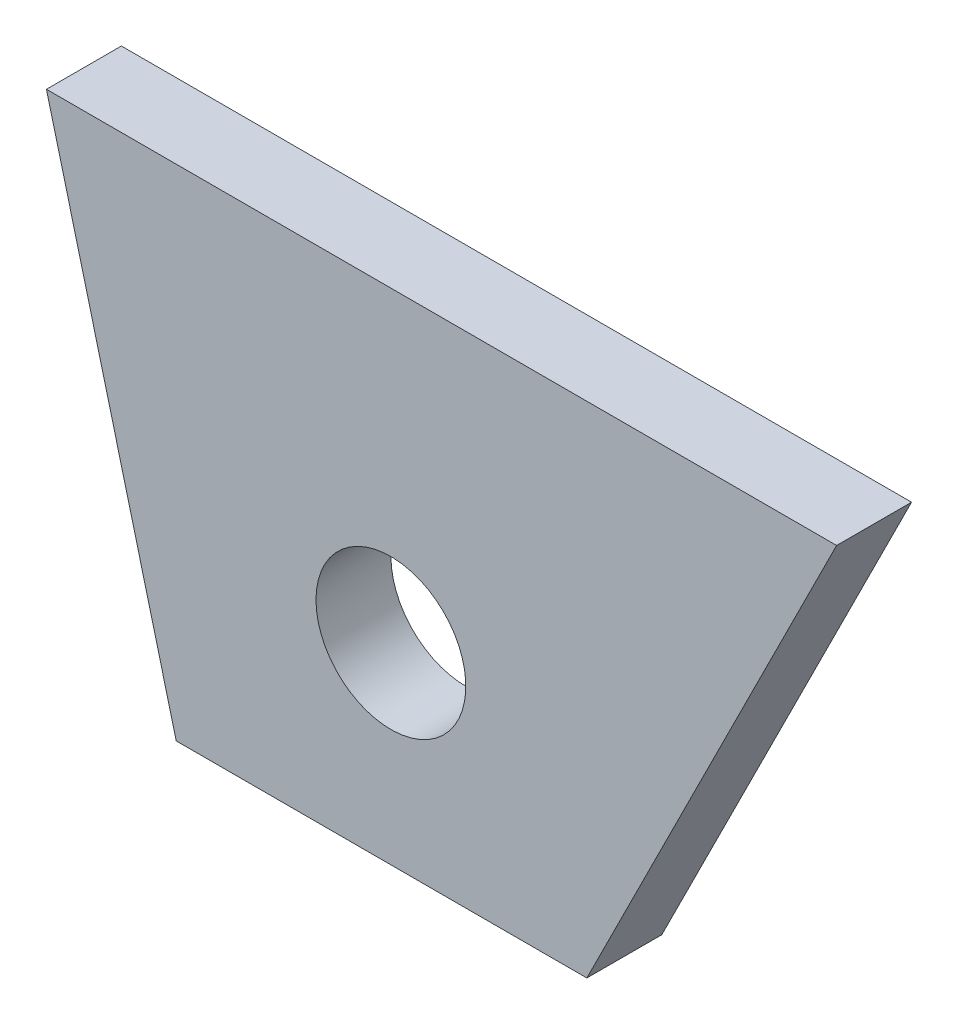
ISO-10303-21;
HEADER;
FILE_DESCRIPTION(('STEP AP214'),'2;1');
FILE_NAME('part.step','',(''),(''),'','','');
FILE_SCHEMA(('AUTOMOTIVE_DESIGN { 1 0 10303 214 1 1 1 1 }'));
ENDSEC;
DATA;
#1=APPLICATION_CONTEXT('core data for automotive mechanical design processes');
#2=APPLICATION_PROTOCOL_DEFINITION('international standard','automotive_design',2000,#1);
#3=PRODUCT_CONTEXT('',#1,'mechanical');
#4=PRODUCT('Part','Part','',(#3));
#5=PRODUCT_RELATED_PRODUCT_CATEGORY('part','',(#4));
#6=PRODUCT_DEFINITION_FORMATION('','',#4);
#7=PRODUCT_DEFINITION_CONTEXT('part definition',#1,'design');
#8=PRODUCT_DEFINITION('design','',#6,#7);
#9=PRODUCT_DEFINITION_SHAPE('','',#8);
#10=(LENGTH_UNIT() NAMED_UNIT(*) SI_UNIT(.MILLI.,.METRE.));
#11=(NAMED_UNIT(*) PLANE_ANGLE_UNIT() SI_UNIT($,.RADIAN.));
#12=(NAMED_UNIT(*) SI_UNIT($,.STERADIAN.) SOLID_ANGLE_UNIT());
#13=UNCERTAINTY_MEASURE_WITH_UNIT(LENGTH_MEASURE(1.E-05),#10,'distance_accuracy_value','');
#14=(GEOMETRIC_REPRESENTATION_CONTEXT(3) GLOBAL_UNCERTAINTY_ASSIGNED_CONTEXT((#13)) GLOBAL_UNIT_ASSIGNED_CONTEXT((#10,
#11,#12)) REPRESENTATION_CONTEXT('',''));
#15=CARTESIAN_POINT('',(0.,0.,0.));
#16=DIRECTION('',(0.,0.,1.));
#17=DIRECTION('',(1.,0.,0.));
#18=AXIS2_PLACEMENT_3D('',#15,#16,#17);
#19=CARTESIAN_POINT('',(0.,0.,76.2));
#20=DIRECTION('',(0.,0.,1.));
#21=DIRECTION('',(1.,0.,0.));
#22=AXIS2_PLACEMENT_3D('',#19,#20,#21);
#23=PLANE('',#22);
#24=DIRECTION('',(0.251475087049697,-0.967863771712397,0.));
#25=VECTOR('',#24,1.);
#26=CARTESIAN_POINT('',(0.,0.,76.2));
#27=LINE('',#26,#25);
#28=CARTESIAN_POINT('',(0.,0.,76.2));
#29=VERTEX_POINT('',#28);
#30=CARTESIAN_POINT('',(131.991038361964,-508.,76.2));
#31=VERTEX_POINT('',#30);
#32=EDGE_CURVE('E85',#29,#31,#27,.T.);
#33=ORIENTED_EDGE('',*,*,#32,.T.);
#34=DIRECTION('',(1.,0.,0.));
#35=VECTOR('',#34,1.);
#36=CARTESIAN_POINT('',(131.991038361964,-508.,76.2));
#37=LINE('',#36,#35);
#38=CARTESIAN_POINT('',(549.615688220996,-508.,76.2));
#39=VERTEX_POINT('',#38);
#40=EDGE_CURVE('E80',#31,#39,#37,.T.);
#41=ORIENTED_EDGE('',*,*,#40,.T.);
#42=DIRECTION('',(0.447270373822084,0.894398799586098,0.));
#43=VECTOR('',#42,1.);
#44=CARTESIAN_POINT('',(549.615688220996,-508.,76.2));
#45=LINE('',#44,#43);
#46=CARTESIAN_POINT('',(803.656,0.,76.2));
#47=VERTEX_POINT('',#46);
#48=EDGE_CURVE('E83',#39,#47,#45,.T.);
#49=ORIENTED_EDGE('',*,*,#48,.T.);
#50=DIRECTION('',(-1.,0.,0.));
#51=VECTOR('',#50,1.);
#52=CARTESIAN_POINT('',(0.,0.,76.2));
#53=LINE('',#52,#51);
#54=EDGE_CURVE('E50',#47,#29,#53,.T.);
#55=ORIENTED_EDGE('',*,*,#54,.T.);
#56=EDGE_LOOP('',(#33,#41,#49,#55));
#57=FACE_BOUND('',#56,.T.);
#58=CARTESIAN_POINT('',(350.334210966216,-312.584818641492,76.2));
#59=DIRECTION('',(0.,0.,1.));
#60=DIRECTION('',(1.,0.,0.));
#61=AXIS2_PLACEMENT_3D('',#58,#59,#60);
#62=CIRCLE('',#61,76.2);
#63=CARTESIAN_POINT('',(274.134210966216,-312.584818641492,76.2));
#64=VERTEX_POINT('',#63);
#65=EDGE_CURVE('E100',#64,#64,#62,.T.);
#66=ORIENTED_EDGE('',*,*,#65,.F.);
#67=EDGE_LOOP('',(#66));
#68=FACE_BOUND('',#67,.T.);
#69=ADVANCED_FACE('F33',(#57,#68),#23,.T.);
#70=CARTESIAN_POINT('',(0.,0.,0.));
#71=DIRECTION('',(0.,0.,1.));
#72=DIRECTION('',(1.,0.,0.));
#73=AXIS2_PLACEMENT_3D('',#70,#71,#72);
#74=PLANE('',#73);
#75=DIRECTION('',(0.251475087049697,-0.967863771712397,0.));
#76=VECTOR('',#75,1.);
#77=CARTESIAN_POINT('',(0.,0.,0.));
#78=LINE('',#77,#76);
#79=CARTESIAN_POINT('',(0.,0.,0.));
#80=VERTEX_POINT('',#79);
#81=CARTESIAN_POINT('',(131.991038361964,-508.,0.));
#82=VERTEX_POINT('',#81);
#83=EDGE_CURVE('E97',#80,#82,#78,.T.);
#84=ORIENTED_EDGE('',*,*,#83,.F.);
#85=DIRECTION('',(-1.,0.,0.));
#86=VECTOR('',#85,1.);
#87=CARTESIAN_POINT('',(0.,0.,0.));
#88=LINE('',#87,#86);
#89=CARTESIAN_POINT('',(803.656,0.,0.));
#90=VERTEX_POINT('',#89);
#91=EDGE_CURVE('E73',#90,#80,#88,.T.);
#92=ORIENTED_EDGE('',*,*,#91,.F.);
#93=DIRECTION('',(0.447270373822084,0.894398799586098,0.));
#94=VECTOR('',#93,1.);
#95=CARTESIAN_POINT('',(549.615688220996,-508.,0.));
#96=LINE('',#95,#94);
#97=CARTESIAN_POINT('',(549.615688220996,-508.,0.));
#98=VERTEX_POINT('',#97);
#99=EDGE_CURVE('E67',#98,#90,#96,.T.);
#100=ORIENTED_EDGE('',*,*,#99,.F.);
#101=DIRECTION('',(1.,0.,0.));
#102=VECTOR('',#101,1.);
#103=CARTESIAN_POINT('',(131.991038361964,-508.,0.));
#104=LINE('',#103,#102);
#105=EDGE_CURVE('E89',#82,#98,#104,.T.);
#106=ORIENTED_EDGE('',*,*,#105,.F.);
#107=EDGE_LOOP('',(#84,#92,#100,#106));
#108=FACE_BOUND('',#107,.T.);
#109=CARTESIAN_POINT('',(350.334210966216,-312.584818641492,0.));
#110=DIRECTION('',(0.,0.,1.));
#111=DIRECTION('',(1.,0.,0.));
#112=AXIS2_PLACEMENT_3D('',#109,#110,#111);
#113=CIRCLE('',#112,76.2);
#114=CARTESIAN_POINT('',(274.134210966216,-312.584818641492,0.));
#115=VERTEX_POINT('',#114);
#116=EDGE_CURVE('E112',#115,#115,#113,.T.);
#117=ORIENTED_EDGE('',*,*,#116,.T.);
#118=EDGE_LOOP('',(#117));
#119=FACE_BOUND('',#118,.T.);
#120=ADVANCED_FACE('F108',(#108,#119),#74,.F.);
#121=CARTESIAN_POINT('',(0.,0.,76.2));
#122=DIRECTION('',(0.967863771712397,0.251475087049697,0.));
#123=DIRECTION('',(-0.251475087049697,0.967863771712397,0.));
#124=AXIS2_PLACEMENT_3D('',#121,#122,#123);
#125=PLANE('',#124);
#126=ORIENTED_EDGE('',*,*,#83,.T.);
#127=DIRECTION('',(0.,0.,-1.));
#128=VECTOR('',#127,1.);
#129=CARTESIAN_POINT('',(131.991038361964,-508.,76.2));
#130=LINE('',#129,#128);
#131=EDGE_CURVE('E11',#31,#82,#130,.T.);
#132=ORIENTED_EDGE('',*,*,#131,.F.);
#133=ORIENTED_EDGE('',*,*,#32,.F.);
#134=DIRECTION('',(0.,0.,-1.));
#135=VECTOR('',#134,1.);
#136=CARTESIAN_POINT('',(0.,0.,76.2));
#137=LINE('',#136,#135);
#138=EDGE_CURVE('E93',#29,#80,#137,.T.);
#139=ORIENTED_EDGE('',*,*,#138,.T.);
#140=EDGE_LOOP('',(#126,#132,#133,#139));
#141=FACE_BOUND('',#140,.T.);
#142=ADVANCED_FACE('F35',(#141),#125,.F.);
#143=CARTESIAN_POINT('',(131.991038361964,-508.,76.2));
#144=DIRECTION('',(0.,1.,0.));
#145=DIRECTION('',(0.,0.,1.));
#146=AXIS2_PLACEMENT_3D('',#143,#144,#145);
#147=PLANE('',#146);
#148=ORIENTED_EDGE('',*,*,#105,.T.);
#149=DIRECTION('',(0.,0.,-1.));
#150=VECTOR('',#149,1.);
#151=CARTESIAN_POINT('',(549.615688220996,-508.,76.2));
#152=LINE('',#151,#150);
#153=EDGE_CURVE('E42',#39,#98,#152,.T.);
#154=ORIENTED_EDGE('',*,*,#153,.F.);
#155=ORIENTED_EDGE('',*,*,#40,.F.);
#156=ORIENTED_EDGE('',*,*,#131,.T.);
#157=EDGE_LOOP('',(#148,#154,#155,#156));
#158=FACE_BOUND('',#157,.T.);
#159=ADVANCED_FACE('F88',(#158),#147,.F.);
#160=CARTESIAN_POINT('',(549.615688220996,-508.,76.2));
#161=DIRECTION('',(-0.894398799586098,0.447270373822084,0.));
#162=DIRECTION('',(-0.447270373822085,-0.894398799586098,0.));
#163=AXIS2_PLACEMENT_3D('',#160,#161,#162);
#164=PLANE('',#163);
#165=ORIENTED_EDGE('',*,*,#99,.T.);
#166=DIRECTION('',(0.,0.,-1.));
#167=VECTOR('',#166,1.);
#168=CARTESIAN_POINT('',(803.656,0.,76.2));
#169=LINE('',#168,#167);
#170=EDGE_CURVE('E90',#47,#90,#169,.T.);
#171=ORIENTED_EDGE('',*,*,#170,.F.);
#172=ORIENTED_EDGE('',*,*,#48,.F.);
#173=ORIENTED_EDGE('',*,*,#153,.T.);
#174=EDGE_LOOP('',(#165,#171,#172,#173));
#175=FACE_BOUND('',#174,.T.);
#176=ADVANCED_FACE('F91',(#175),#164,.F.);
#177=CARTESIAN_POINT('',(0.,0.,76.2));
#178=DIRECTION('',(0.,-1.,0.));
#179=DIRECTION('',(0.,0.,-1.));
#180=AXIS2_PLACEMENT_3D('',#177,#178,#179);
#181=PLANE('',#180);
#182=ORIENTED_EDGE('',*,*,#91,.T.);
#183=ORIENTED_EDGE('',*,*,#138,.F.);
#184=ORIENTED_EDGE('',*,*,#54,.F.);
#185=ORIENTED_EDGE('',*,*,#170,.T.);
#186=EDGE_LOOP('',(#182,#183,#184,#185));
#187=FACE_BOUND('',#186,.T.);
#188=ADVANCED_FACE('F105',(#187),#181,.F.);
#189=CARTESIAN_POINT('',(350.334210966216,-312.584818641492,76.2));
#190=DIRECTION('',(0.,0.,-1.));
#191=DIRECTION('',(-1.,0.,0.));
#192=AXIS2_PLACEMENT_3D('',#189,#190,#191);
#193=CYLINDRICAL_SURFACE('',#192,76.2);
#194=CARTESIAN_POINT('',(274.134210966216,-312.584818641492,76.2));
#195=CARTESIAN_POINT('',(274.134210966216,-312.584818641492,75.40625));
#196=CARTESIAN_POINT('',(274.134210966216,-312.584818641492,74.6125));
#197=CARTESIAN_POINT('',(274.134210966216,-312.584818641492,73.025));
#198=CARTESIAN_POINT('',(274.134210966216,-312.584818641492,72.23125));
#199=CARTESIAN_POINT('',(274.134210966216,-312.584818641492,70.64375));
#200=CARTESIAN_POINT('',(274.134210966216,-312.584818641492,69.85));
#201=CARTESIAN_POINT('',(274.134210966216,-312.584818641492,68.2625));
#202=CARTESIAN_POINT('',(274.134210966216,-312.584818641492,67.46875));
#203=CARTESIAN_POINT('',(274.134210966216,-312.584818641492,65.88125));
#204=CARTESIAN_POINT('',(274.134210966216,-312.584818641492,65.0875));
#205=CARTESIAN_POINT('',(274.134210966216,-312.584818641492,63.5));
#206=CARTESIAN_POINT('',(274.134210966216,-312.584818641492,62.70625));
#207=CARTESIAN_POINT('',(274.134210966216,-312.584818641492,61.11875));
#208=CARTESIAN_POINT('',(274.134210966216,-312.584818641492,60.325));
#209=CARTESIAN_POINT('',(274.134210966216,-312.584818641492,58.7375));
#210=CARTESIAN_POINT('',(274.134210966216,-312.584818641492,57.94375));
#211=CARTESIAN_POINT('',(274.134210966216,-312.584818641492,56.35625));
#212=CARTESIAN_POINT('',(274.134210966216,-312.584818641492,55.5625));
#213=CARTESIAN_POINT('',(274.134210966216,-312.584818641492,53.975));
#214=CARTESIAN_POINT('',(274.134210966216,-312.584818641492,53.18125));
#215=CARTESIAN_POINT('',(274.134210966216,-312.584818641492,51.59375));
#216=CARTESIAN_POINT('',(274.134210966216,-312.584818641492,50.8));
#217=CARTESIAN_POINT('',(274.134210966216,-312.584818641492,49.2125));
#218=CARTESIAN_POINT('',(274.134210966216,-312.584818641492,48.41875));
#219=CARTESIAN_POINT('',(274.134210966216,-312.584818641492,46.83125));
#220=CARTESIAN_POINT('',(274.134210966216,-312.584818641492,46.0375));
#221=CARTESIAN_POINT('',(274.134210966216,-312.584818641492,44.45));
#222=CARTESIAN_POINT('',(274.134210966216,-312.584818641492,43.65625));
#223=CARTESIAN_POINT('',(274.134210966216,-312.584818641492,42.06875));
#224=CARTESIAN_POINT('',(274.134210966216,-312.584818641492,41.275));
#225=CARTESIAN_POINT('',(274.134210966216,-312.584818641492,39.6875));
#226=CARTESIAN_POINT('',(274.134210966216,-312.584818641492,38.89375));
#227=CARTESIAN_POINT('',(274.134210966216,-312.584818641492,37.30625));
#228=CARTESIAN_POINT('',(274.134210966216,-312.584818641492,36.5125));
#229=CARTESIAN_POINT('',(274.134210966216,-312.584818641492,34.925));
#230=CARTESIAN_POINT('',(274.134210966216,-312.584818641492,34.13125));
#231=CARTESIAN_POINT('',(274.134210966216,-312.584818641492,32.54375));
#232=CARTESIAN_POINT('',(274.134210966216,-312.584818641492,31.75));
#233=CARTESIAN_POINT('',(274.134210966216,-312.584818641492,30.1625));
#234=CARTESIAN_POINT('',(274.134210966216,-312.584818641492,29.36875));
#235=CARTESIAN_POINT('',(274.134210966216,-312.584818641492,27.78125));
#236=CARTESIAN_POINT('',(274.134210966216,-312.584818641492,26.9875));
#237=CARTESIAN_POINT('',(274.134210966216,-312.584818641492,25.4));
#238=CARTESIAN_POINT('',(274.134210966216,-312.584818641492,24.60625));
#239=CARTESIAN_POINT('',(274.134210966216,-312.584818641492,23.01875));
#240=CARTESIAN_POINT('',(274.134210966216,-312.584818641492,22.225));
#241=CARTESIAN_POINT('',(274.134210966216,-312.584818641492,20.6375));
#242=CARTESIAN_POINT('',(274.134210966216,-312.584818641492,19.84375));
#243=CARTESIAN_POINT('',(274.134210966216,-312.584818641492,18.25625));
#244=CARTESIAN_POINT('',(274.134210966216,-312.584818641492,17.4625));
#245=CARTESIAN_POINT('',(274.134210966216,-312.584818641492,15.875));
#246=CARTESIAN_POINT('',(274.134210966216,-312.584818641492,15.08125));
#247=CARTESIAN_POINT('',(274.134210966216,-312.584818641492,13.49375));
#248=CARTESIAN_POINT('',(274.134210966216,-312.584818641492,12.7));
#249=CARTESIAN_POINT('',(274.134210966216,-312.584818641492,11.1125));
#250=CARTESIAN_POINT('',(274.134210966216,-312.584818641492,10.31875));
#251=CARTESIAN_POINT('',(274.134210966216,-312.584818641492,8.73125));
#252=CARTESIAN_POINT('',(274.134210966216,-312.584818641492,7.93750000000001));
#253=CARTESIAN_POINT('',(274.134210966216,-312.584818641492,6.35));
#254=CARTESIAN_POINT('',(274.134210966216,-312.584818641492,5.55625));
#255=CARTESIAN_POINT('',(274.134210966216,-312.584818641492,3.96875));
#256=CARTESIAN_POINT('',(274.134210966216,-312.584818641492,3.175));
#257=CARTESIAN_POINT('',(274.134210966216,-312.584818641492,1.5875));
#258=CARTESIAN_POINT('',(274.134210966216,-312.584818641492,0.793750000000001));
#259=CARTESIAN_POINT('',(274.134210966216,-312.584818641492,0.));
#260=B_SPLINE_CURVE_WITH_KNOTS('',3,(#194,#195,#196,#197,#198,#199,#200,#201,#202,#203,#204,
#205,#206,#207,#208,#209,#210,#211,#212,#213,#214,#215,#216,#217,#218,#219,#220,#221,#222,#223,
#224,#225,#226,#227,#228,#229,#230,#231,#232,#233,#234,#235,#236,#237,#238,#239,#240,#241,#242,
#243,#244,#245,#246,#247,#248,#249,#250,#251,#252,#253,#254,#255,#256,#257,#258,#259),
.UNSPECIFIED.,.F.,.F.,(4,2,2,2,2,2,2,2,2,2,2,2,2,2,2,2,2,2,2,2,2,2,2,2,2,2,2,2,2,2,2,2,4),(0.,
2.38125,4.7625,7.14375,9.52500000000001,11.90625,14.2875,16.66875,19.05,21.43125,23.8125,
26.19375,28.575,30.95625,33.3375,35.71875,38.1,40.48125,42.8625,45.24375,47.625,50.00625,
52.3875,54.76875,57.15,59.53125,61.9125,64.29375,66.675,69.05625,71.4375,73.81875,76.2),.UNSPECIFIED.);
#261=EDGE_CURVE('BSEAM118',#64,#115,#260,.T.);
#262=ORIENTED_EDGE('',*,*,#65,.T.);
#263=ORIENTED_EDGE('',*,*,#116,.F.);
#264=ORIENTED_EDGE('',*,*,#261,.T.);
#265=ORIENTED_EDGE('',*,*,#261,.F.);
#266=EDGE_LOOP('',(#262,#264,#263,#265));
#267=FACE_BOUND('',#266,.T.);
#268=ADVANCED_FACE('F118',(#267),#193,.F.);
#269=CLOSED_SHELL('',(#69,#120,#142,#159,#176,#188,#268));
#270=MANIFOLD_SOLID_BREP('B2',#269);
#271=ADVANCED_BREP_SHAPE_REPRESENTATION('',(#18,#270),#14);
#272=SHAPE_DEFINITION_REPRESENTATION(#9,#271);
ENDSEC;
END-ISO-10303-21;
